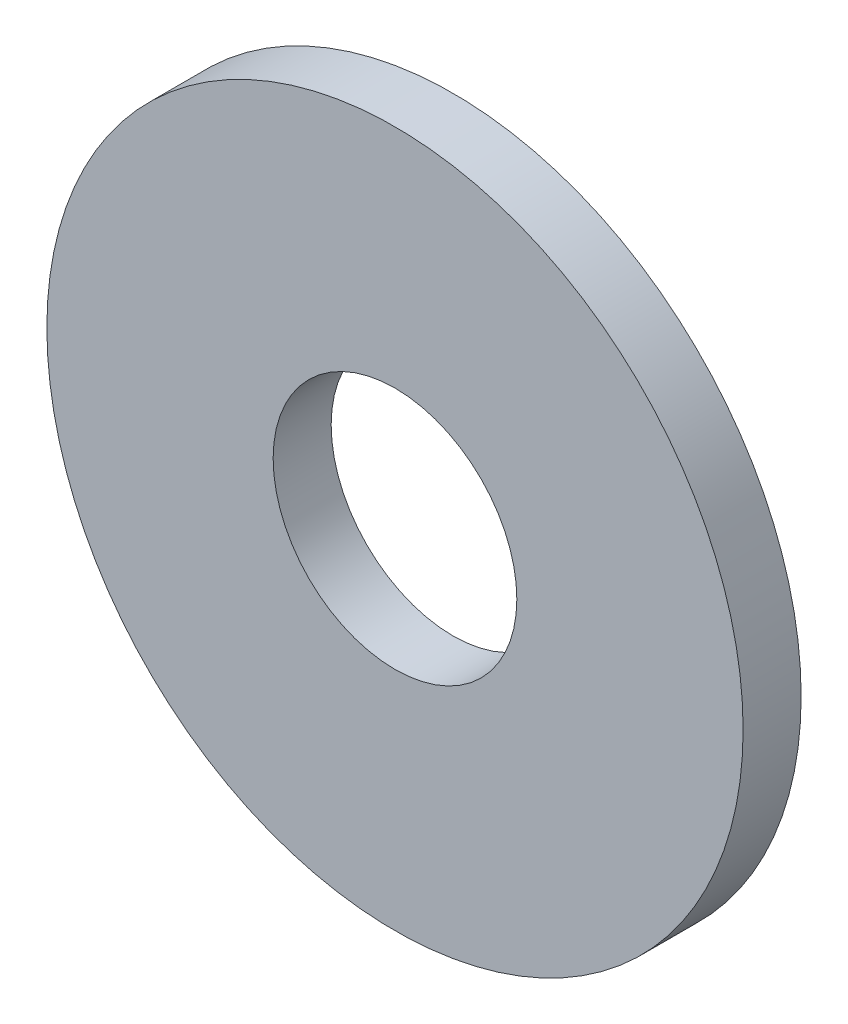
ISO-10303-21;
HEADER;
FILE_DESCRIPTION(('STEP AP214'),'2;1');
FILE_NAME('part.step','',(''),(''),'','','');
FILE_SCHEMA(('AUTOMOTIVE_DESIGN { 1 0 10303 214 1 1 1 1 }'));
ENDSEC;
DATA;
#1=APPLICATION_CONTEXT('core data for automotive mechanical design processes');
#2=APPLICATION_PROTOCOL_DEFINITION('international standard','automotive_design',2000,#1);
#3=PRODUCT_CONTEXT('',#1,'mechanical');
#4=PRODUCT('Part','Part','',(#3));
#5=PRODUCT_RELATED_PRODUCT_CATEGORY('part','',(#4));
#6=PRODUCT_DEFINITION_FORMATION('','',#4);
#7=PRODUCT_DEFINITION_CONTEXT('part definition',#1,'design');
#8=PRODUCT_DEFINITION('design','',#6,#7);
#9=PRODUCT_DEFINITION_SHAPE('','',#8);
#10=(LENGTH_UNIT() NAMED_UNIT(*) SI_UNIT(.MILLI.,.METRE.));
#11=(NAMED_UNIT(*) PLANE_ANGLE_UNIT() SI_UNIT($,.RADIAN.));
#12=(NAMED_UNIT(*) SI_UNIT($,.STERADIAN.) SOLID_ANGLE_UNIT());
#13=UNCERTAINTY_MEASURE_WITH_UNIT(LENGTH_MEASURE(1.E-05),#10,'distance_accuracy_value','');
#14=(GEOMETRIC_REPRESENTATION_CONTEXT(3) GLOBAL_UNCERTAINTY_ASSIGNED_CONTEXT((#13)) GLOBAL_UNIT_ASSIGNED_CONTEXT((#10,
#11,#12)) REPRESENTATION_CONTEXT('',''));
#15=CARTESIAN_POINT('',(0.,0.,0.));
#16=DIRECTION('',(0.,0.,1.));
#17=DIRECTION('',(1.,0.,0.));
#18=AXIS2_PLACEMENT_3D('',#15,#16,#17);
#19=CARTESIAN_POINT('',(0.,0.,2.));
#20=DIRECTION('',(0.,0.,1.));
#21=DIRECTION('',(1.,0.,0.));
#22=AXIS2_PLACEMENT_3D('',#19,#20,#21);
#23=PLANE('',#22);
#24=CARTESIAN_POINT('',(0.,0.,2.));
#25=DIRECTION('',(0.,0.,1.));
#26=DIRECTION('',(1.,0.,0.));
#27=AXIS2_PLACEMENT_3D('',#24,#25,#26);
#28=CIRCLE('',#27,12.);
#29=CARTESIAN_POINT('',(12.,0.,2.));
#30=VERTEX_POINT('',#29);
#31=EDGE_CURVE('E10',#30,#30,#28,.T.);
#32=ORIENTED_EDGE('',*,*,#31,.T.);
#33=EDGE_LOOP('',(#32));
#34=FACE_BOUND('',#33,.T.);
#35=CARTESIAN_POINT('',(0.,0.,2.));
#36=DIRECTION('',(0.,0.,1.));
#37=DIRECTION('',(1.,0.,0.));
#38=AXIS2_PLACEMENT_3D('',#35,#36,#37);
#39=CIRCLE('',#38,4.2);
#40=CARTESIAN_POINT('',(4.2,0.,2.));
#41=VERTEX_POINT('',#40);
#42=EDGE_CURVE('E50',#41,#41,#39,.T.);
#43=ORIENTED_EDGE('',*,*,#42,.F.);
#44=EDGE_LOOP('',(#43));
#45=FACE_BOUND('',#44,.T.);
#46=ADVANCED_FACE('F37',(#34,#45),#23,.T.);
#47=CARTESIAN_POINT('',(0.,0.,0.));
#48=DIRECTION('',(0.,0.,1.));
#49=DIRECTION('',(1.,0.,0.));
#50=AXIS2_PLACEMENT_3D('',#47,#48,#49);
#51=PLANE('',#50);
#52=CARTESIAN_POINT('',(0.,0.,0.));
#53=DIRECTION('',(0.,0.,1.));
#54=DIRECTION('',(1.,0.,0.));
#55=AXIS2_PLACEMENT_3D('',#52,#53,#54);
#56=CIRCLE('',#55,12.);
#57=CARTESIAN_POINT('',(12.,0.,0.));
#58=VERTEX_POINT('',#57);
#59=EDGE_CURVE('E41',#58,#58,#56,.T.);
#60=ORIENTED_EDGE('',*,*,#59,.F.);
#61=EDGE_LOOP('',(#60));
#62=FACE_BOUND('',#61,.T.);
#63=CARTESIAN_POINT('',(0.,0.,0.));
#64=DIRECTION('',(0.,0.,1.));
#65=DIRECTION('',(1.,0.,0.));
#66=AXIS2_PLACEMENT_3D('',#63,#64,#65);
#67=CIRCLE('',#66,4.2);
#68=CARTESIAN_POINT('',(4.2,0.,0.));
#69=VERTEX_POINT('',#68);
#70=EDGE_CURVE('E52',#69,#69,#67,.T.);
#71=ORIENTED_EDGE('',*,*,#70,.T.);
#72=EDGE_LOOP('',(#71));
#73=FACE_BOUND('',#72,.T.);
#74=ADVANCED_FACE('F64',(#62,#73),#51,.F.);
#75=CARTESIAN_POINT('',(0.,0.,2.));
#76=DIRECTION('',(0.,0.,-1.));
#77=DIRECTION('',(-1.,0.,0.));
#78=AXIS2_PLACEMENT_3D('',#75,#76,#77);
#79=CYLINDRICAL_SURFACE('',#78,12.);
#80=ORIENTED_EDGE('',*,*,#31,.F.);
#81=EDGE_LOOP('',(#80));
#82=FACE_BOUND('',#81,.T.);
#83=ORIENTED_EDGE('',*,*,#59,.T.);
#84=EDGE_LOOP('',(#83));
#85=FACE_BOUND('',#84,.T.);
#86=ADVANCED_FACE('F39',(#82,#85),#79,.T.);
#87=CARTESIAN_POINT('',(0.,0.,2.));
#88=DIRECTION('',(0.,0.,-1.));
#89=DIRECTION('',(-1.,0.,0.));
#90=AXIS2_PLACEMENT_3D('',#87,#88,#89);
#91=CYLINDRICAL_SURFACE('',#90,4.2);
#92=ORIENTED_EDGE('',*,*,#42,.T.);
#93=EDGE_LOOP('',(#92));
#94=FACE_BOUND('',#93,.T.);
#95=ORIENTED_EDGE('',*,*,#70,.F.);
#96=EDGE_LOOP('',(#95));
#97=FACE_BOUND('',#96,.T.);
#98=ADVANCED_FACE('F60',(#94,#97),#91,.F.);
#99=CLOSED_SHELL('',(#46,#74,#86,#98));
#100=MANIFOLD_SOLID_BREP('B2',#99);
#101=ADVANCED_BREP_SHAPE_REPRESENTATION('',(#18,#100),#14);
#102=SHAPE_DEFINITION_REPRESENTATION(#9,#101);
ENDSEC;
END-ISO-10303-21;
